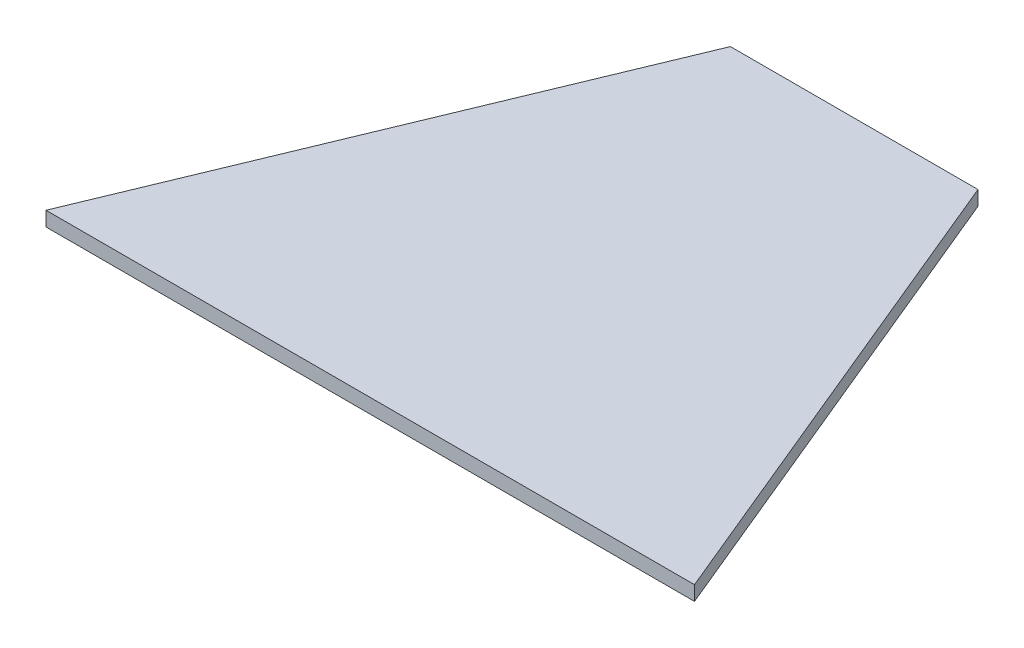
ISO-10303-21;
HEADER;
FILE_DESCRIPTION(('STEP AP214'),'2;1');
FILE_NAME('part.step','',(''),(''),'','','');
FILE_SCHEMA(('AUTOMOTIVE_DESIGN { 1 0 10303 214 1 1 1 1 }'));
ENDSEC;
DATA;
#1=APPLICATION_CONTEXT('core data for automotive mechanical design processes');
#2=APPLICATION_PROTOCOL_DEFINITION('international standard','automotive_design',2000,#1);
#3=PRODUCT_CONTEXT('',#1,'mechanical');
#4=PRODUCT('Part','Part','',(#3));
#5=PRODUCT_RELATED_PRODUCT_CATEGORY('part','',(#4));
#6=PRODUCT_DEFINITION_FORMATION('','',#4);
#7=PRODUCT_DEFINITION_CONTEXT('part definition',#1,'design');
#8=PRODUCT_DEFINITION('design','',#6,#7);
#9=PRODUCT_DEFINITION_SHAPE('','',#8);
#10=(LENGTH_UNIT() NAMED_UNIT(*) SI_UNIT(.MILLI.,.METRE.));
#11=(NAMED_UNIT(*) PLANE_ANGLE_UNIT() SI_UNIT($,.RADIAN.));
#12=(NAMED_UNIT(*) SI_UNIT($,.STERADIAN.) SOLID_ANGLE_UNIT());
#13=UNCERTAINTY_MEASURE_WITH_UNIT(LENGTH_MEASURE(1.E-05),#10,'distance_accuracy_value','');
#14=(GEOMETRIC_REPRESENTATION_CONTEXT(3) GLOBAL_UNCERTAINTY_ASSIGNED_CONTEXT((#13)) GLOBAL_UNIT_ASSIGNED_CONTEXT((#10,
#11,#12)) REPRESENTATION_CONTEXT('',''));
#15=CARTESIAN_POINT('',(0.,0.,0.));
#16=DIRECTION('',(0.,0.,1.));
#17=DIRECTION('',(1.,0.,0.));
#18=AXIS2_PLACEMENT_3D('',#15,#16,#17);
#19=CARTESIAN_POINT('',(0.,3.,0.));
#20=DIRECTION('',(0.923879532511288,0.,0.382683432365088));
#21=DIRECTION('',(0.382683432365088,0.,-0.923879532511288));
#22=AXIS2_PLACEMENT_3D('',#19,#20,#21);
#23=PLANE('',#22);
#24=DIRECTION('',(-0.382683432365087,0.,0.923879532511288));
#25=VECTOR('',#24,1.);
#26=CARTESIAN_POINT('',(0.,0.,0.));
#27=LINE('',#26,#25);
#28=CARTESIAN_POINT('',(41.4213562373092,0.,-100.));
#29=VERTEX_POINT('',#28);
#30=CARTESIAN_POINT('',(0.,0.,0.));
#31=VERTEX_POINT('',#30);
#32=EDGE_CURVE('E107',#29,#31,#27,.T.);
#33=ORIENTED_EDGE('',*,*,#32,.T.);
#34=DIRECTION('',(0.,-1.,0.));
#35=VECTOR('',#34,1.);
#36=CARTESIAN_POINT('',(0.,3.,0.));
#37=LINE('',#36,#35);
#38=CARTESIAN_POINT('',(0.,3.,0.));
#39=VERTEX_POINT('',#38);
#40=EDGE_CURVE('E11',#39,#31,#37,.T.);
#41=ORIENTED_EDGE('',*,*,#40,.F.);
#42=DIRECTION('',(-0.382683432365087,0.,0.923879532511288));
#43=VECTOR('',#42,1.);
#44=CARTESIAN_POINT('',(0.,3.,0.));
#45=LINE('',#44,#43);
#46=CARTESIAN_POINT('',(41.4213562373092,3.,-100.));
#47=VERTEX_POINT('',#46);
#48=EDGE_CURVE('E91',#47,#39,#45,.T.);
#49=ORIENTED_EDGE('',*,*,#48,.F.);
#50=DIRECTION('',(0.,-1.,0.));
#51=VECTOR('',#50,1.);
#52=CARTESIAN_POINT('',(41.4213562373092,3.,-100.));
#53=LINE('',#52,#51);
#54=EDGE_CURVE('E103',#47,#29,#53,.T.);
#55=ORIENTED_EDGE('',*,*,#54,.T.);
#56=EDGE_LOOP('',(#33,#41,#49,#55));
#57=FACE_BOUND('',#56,.T.);
#58=ADVANCED_FACE('F39',(#57),#23,.F.);
#59=CARTESIAN_POINT('',(0.,3.,0.));
#60=DIRECTION('',(0.,0.,-1.));
#61=DIRECTION('',(-1.,0.,0.));
#62=AXIS2_PLACEMENT_3D('',#59,#60,#61);
#63=PLANE('',#62);
#64=DIRECTION('',(1.,0.,0.));
#65=VECTOR('',#64,1.);
#66=CARTESIAN_POINT('',(0.,0.,0.));
#67=LINE('',#66,#65);
#68=CARTESIAN_POINT('',(134.,0.,0.));
#69=VERTEX_POINT('',#68);
#70=EDGE_CURVE('E96',#31,#69,#67,.T.);
#71=ORIENTED_EDGE('',*,*,#70,.T.);
#72=DIRECTION('',(0.,-1.,0.));
#73=VECTOR('',#72,1.);
#74=CARTESIAN_POINT('',(134.,3.,0.));
#75=LINE('',#74,#73);
#76=CARTESIAN_POINT('',(134.,3.,0.));
#77=VERTEX_POINT('',#76);
#78=EDGE_CURVE('E48',#77,#69,#75,.T.);
#79=ORIENTED_EDGE('',*,*,#78,.F.);
#80=DIRECTION('',(1.,0.,0.));
#81=VECTOR('',#80,1.);
#82=CARTESIAN_POINT('',(0.,3.,0.));
#83=LINE('',#82,#81);
#84=EDGE_CURVE('E86',#39,#77,#83,.T.);
#85=ORIENTED_EDGE('',*,*,#84,.F.);
#86=ORIENTED_EDGE('',*,*,#40,.T.);
#87=EDGE_LOOP('',(#71,#79,#85,#86));
#88=FACE_BOUND('',#87,.T.);
#89=ADVANCED_FACE('F95',(#88),#63,.F.);
#90=CARTESIAN_POINT('',(134.,3.,0.));
#91=DIRECTION('',(-0.923879532511285,0.,0.382683432365094));
#92=DIRECTION('',(0.382683432365094,0.,0.923879532511285));
#93=AXIS2_PLACEMENT_3D('',#90,#91,#92);
#94=PLANE('',#93);
#95=DIRECTION('',(-0.382683432365094,0.,-0.923879532511285));
#96=VECTOR('',#95,1.);
#97=CARTESIAN_POINT('',(134.,0.,0.));
#98=LINE('',#97,#96);
#99=CARTESIAN_POINT('',(92.57864376269,0.,-100.));
#100=VERTEX_POINT('',#99);
#101=EDGE_CURVE('E73',#69,#100,#98,.T.);
#102=ORIENTED_EDGE('',*,*,#101,.T.);
#103=DIRECTION('',(0.,-1.,0.));
#104=VECTOR('',#103,1.);
#105=CARTESIAN_POINT('',(92.57864376269,3.,-100.));
#106=LINE('',#105,#104);
#107=CARTESIAN_POINT('',(92.57864376269,3.,-100.));
#108=VERTEX_POINT('',#107);
#109=EDGE_CURVE('E98',#108,#100,#106,.T.);
#110=ORIENTED_EDGE('',*,*,#109,.F.);
#111=DIRECTION('',(-0.382683432365094,0.,-0.923879532511285));
#112=VECTOR('',#111,1.);
#113=CARTESIAN_POINT('',(134.,3.,0.));
#114=LINE('',#113,#112);
#115=EDGE_CURVE('E89',#77,#108,#114,.T.);
#116=ORIENTED_EDGE('',*,*,#115,.F.);
#117=ORIENTED_EDGE('',*,*,#78,.T.);
#118=EDGE_LOOP('',(#102,#110,#116,#117));
#119=FACE_BOUND('',#118,.T.);
#120=ADVANCED_FACE('F99',(#119),#94,.F.);
#121=CARTESIAN_POINT('',(41.4213562373092,3.,-100.));
#122=DIRECTION('',(0.,0.,1.));
#123=DIRECTION('',(1.,0.,0.));
#124=AXIS2_PLACEMENT_3D('',#121,#122,#123);
#125=PLANE('',#124);
#126=DIRECTION('',(-1.,0.,0.));
#127=VECTOR('',#126,1.);
#128=CARTESIAN_POINT('',(41.4213562373092,0.,-100.));
#129=LINE('',#128,#127);
#130=EDGE_CURVE('E79',#100,#29,#129,.T.);
#131=ORIENTED_EDGE('',*,*,#130,.T.);
#132=ORIENTED_EDGE('',*,*,#54,.F.);
#133=DIRECTION('',(-1.,0.,0.));
#134=VECTOR('',#133,1.);
#135=CARTESIAN_POINT('',(41.4213562373092,3.,-100.));
#136=LINE('',#135,#134);
#137=EDGE_CURVE('E56',#108,#47,#136,.T.);
#138=ORIENTED_EDGE('',*,*,#137,.F.);
#139=ORIENTED_EDGE('',*,*,#109,.T.);
#140=EDGE_LOOP('',(#131,#132,#138,#139));
#141=FACE_BOUND('',#140,.T.);
#142=ADVANCED_FACE('F120',(#141),#125,.F.);
#143=CARTESIAN_POINT('',(0.,3.,0.));
#144=DIRECTION('',(0.,-1.,0.));
#145=DIRECTION('',(0.,0.,-1.));
#146=AXIS2_PLACEMENT_3D('',#143,#144,#145);
#147=PLANE('',#146);
#148=ORIENTED_EDGE('',*,*,#48,.T.);
#149=ORIENTED_EDGE('',*,*,#84,.T.);
#150=ORIENTED_EDGE('',*,*,#115,.T.);
#151=ORIENTED_EDGE('',*,*,#137,.T.);
#152=EDGE_LOOP('',(#148,#149,#150,#151));
#153=FACE_BOUND('',#152,.T.);
#154=ADVANCED_FACE('F87',(#153),#147,.F.);
#155=CARTESIAN_POINT('',(0.,0.,0.));
#156=DIRECTION('',(0.,-1.,0.));
#157=DIRECTION('',(0.,0.,-1.));
#158=AXIS2_PLACEMENT_3D('',#155,#156,#157);
#159=PLANE('',#158);
#160=ORIENTED_EDGE('',*,*,#32,.F.);
#161=ORIENTED_EDGE('',*,*,#130,.F.);
#162=ORIENTED_EDGE('',*,*,#101,.F.);
#163=ORIENTED_EDGE('',*,*,#70,.F.);
#164=EDGE_LOOP('',(#160,#161,#162,#163));
#165=FACE_BOUND('',#164,.T.);
#166=ADVANCED_FACE('F123',(#165),#159,.T.);
#167=CLOSED_SHELL('',(#58,#89,#120,#142,#154,#166));
#168=MANIFOLD_SOLID_BREP('B2',#167);
#169=ADVANCED_BREP_SHAPE_REPRESENTATION('',(#18,#168),#14);
#170=SHAPE_DEFINITION_REPRESENTATION(#9,#169);
ENDSEC;
END-ISO-10303-21;
